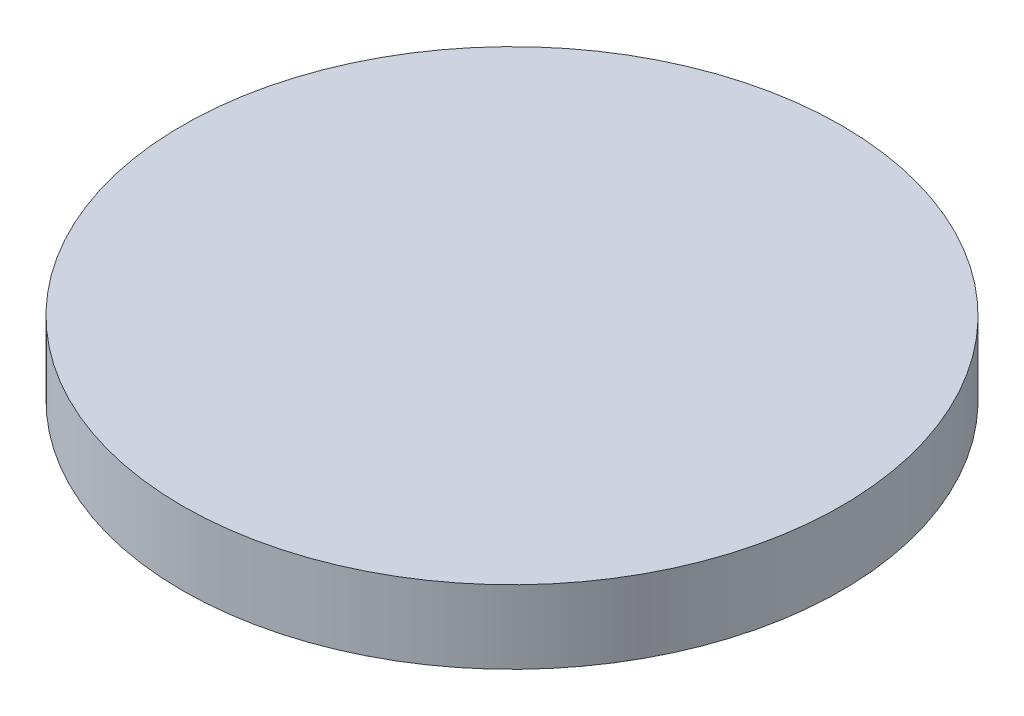
ISO-10303-21;
HEADER;
FILE_DESCRIPTION(('STEP AP214'),'2;1');
FILE_NAME('part.step','',(''),(''),'','','');
FILE_SCHEMA(('AUTOMOTIVE_DESIGN { 1 0 10303 214 1 1 1 1 }'));
ENDSEC;
DATA;
#1=APPLICATION_CONTEXT('core data for automotive mechanical design processes');
#2=APPLICATION_PROTOCOL_DEFINITION('international standard','automotive_design',2000,#1);
#3=PRODUCT_CONTEXT('',#1,'mechanical');
#4=PRODUCT('Part','Part','',(#3));
#5=PRODUCT_RELATED_PRODUCT_CATEGORY('part','',(#4));
#6=PRODUCT_DEFINITION_FORMATION('','',#4);
#7=PRODUCT_DEFINITION_CONTEXT('part definition',#1,'design');
#8=PRODUCT_DEFINITION('design','',#6,#7);
#9=PRODUCT_DEFINITION_SHAPE('','',#8);
#10=(LENGTH_UNIT() NAMED_UNIT(*) SI_UNIT(.MILLI.,.METRE.));
#11=(NAMED_UNIT(*) PLANE_ANGLE_UNIT() SI_UNIT($,.RADIAN.));
#12=(NAMED_UNIT(*) SI_UNIT($,.STERADIAN.) SOLID_ANGLE_UNIT());
#13=UNCERTAINTY_MEASURE_WITH_UNIT(LENGTH_MEASURE(1.E-05),#10,'distance_accuracy_value','');
#14=(GEOMETRIC_REPRESENTATION_CONTEXT(3) GLOBAL_UNCERTAINTY_ASSIGNED_CONTEXT((#13)) GLOBAL_UNIT_ASSIGNED_CONTEXT((#10,
#11,#12)) REPRESENTATION_CONTEXT('',''));
#15=CARTESIAN_POINT('',(0.,0.,0.));
#16=DIRECTION('',(0.,0.,1.));
#17=DIRECTION('',(1.,0.,0.));
#18=AXIS2_PLACEMENT_3D('',#15,#16,#17);
#19=CARTESIAN_POINT('',(0.,2.3,0.));
#20=DIRECTION('',(0.,-1.,0.));
#21=DIRECTION('',(0.,0.,-1.));
#22=AXIS2_PLACEMENT_3D('',#19,#20,#21);
#23=CYLINDRICAL_SURFACE('',#22,10.35);
#24=CARTESIAN_POINT('',(0.,2.3,0.));
#25=DIRECTION('',(0.,1.,0.));
#26=DIRECTION('',(0.,0.,1.));
#27=AXIS2_PLACEMENT_3D('',#24,#25,#26);
#28=CIRCLE('',#27,10.35);
#29=CARTESIAN_POINT('',(0.,2.3,10.35));
#30=VERTEX_POINT('',#29);
#31=EDGE_CURVE('E10',#30,#30,#28,.T.);
#32=ORIENTED_EDGE('',*,*,#31,.F.);
#33=EDGE_LOOP('',(#32));
#34=FACE_BOUND('',#33,.T.);
#35=CARTESIAN_POINT('',(0.,0.,0.));
#36=DIRECTION('',(0.,1.,0.));
#37=DIRECTION('',(0.,0.,1.));
#38=AXIS2_PLACEMENT_3D('',#35,#36,#37);
#39=CIRCLE('',#38,10.35);
#40=CARTESIAN_POINT('',(0.,0.,10.35));
#41=VERTEX_POINT('',#40);
#42=EDGE_CURVE('E40',#41,#41,#39,.T.);
#43=ORIENTED_EDGE('',*,*,#42,.T.);
#44=EDGE_LOOP('',(#43));
#45=FACE_BOUND('',#44,.T.);
#46=ADVANCED_FACE('F37',(#34,#45),#23,.T.);
#47=CARTESIAN_POINT('',(0.,2.3,0.));
#48=DIRECTION('',(0.,1.,0.));
#49=DIRECTION('',(0.,0.,1.));
#50=AXIS2_PLACEMENT_3D('',#47,#48,#49);
#51=PLANE('',#50);
#52=ORIENTED_EDGE('',*,*,#31,.T.);
#53=EDGE_LOOP('',(#52));
#54=FACE_BOUND('',#53,.T.);
#55=ADVANCED_FACE('F54',(#54),#51,.T.);
#56=CARTESIAN_POINT('',(0.,0.,0.));
#57=DIRECTION('',(0.,1.,0.));
#58=DIRECTION('',(0.,0.,1.));
#59=AXIS2_PLACEMENT_3D('',#56,#57,#58);
#60=PLANE('',#59);
#61=ORIENTED_EDGE('',*,*,#42,.F.);
#62=EDGE_LOOP('',(#61));
#63=FACE_BOUND('',#62,.T.);
#64=ADVANCED_FACE('F52',(#63),#60,.F.);
#65=CLOSED_SHELL('',(#46,#55,#64));
#66=MANIFOLD_SOLID_BREP('B2',#65);
#67=ADVANCED_BREP_SHAPE_REPRESENTATION('',(#18,#66),#14);
#68=SHAPE_DEFINITION_REPRESENTATION(#9,#67);
ENDSEC;
END-ISO-10303-21;
